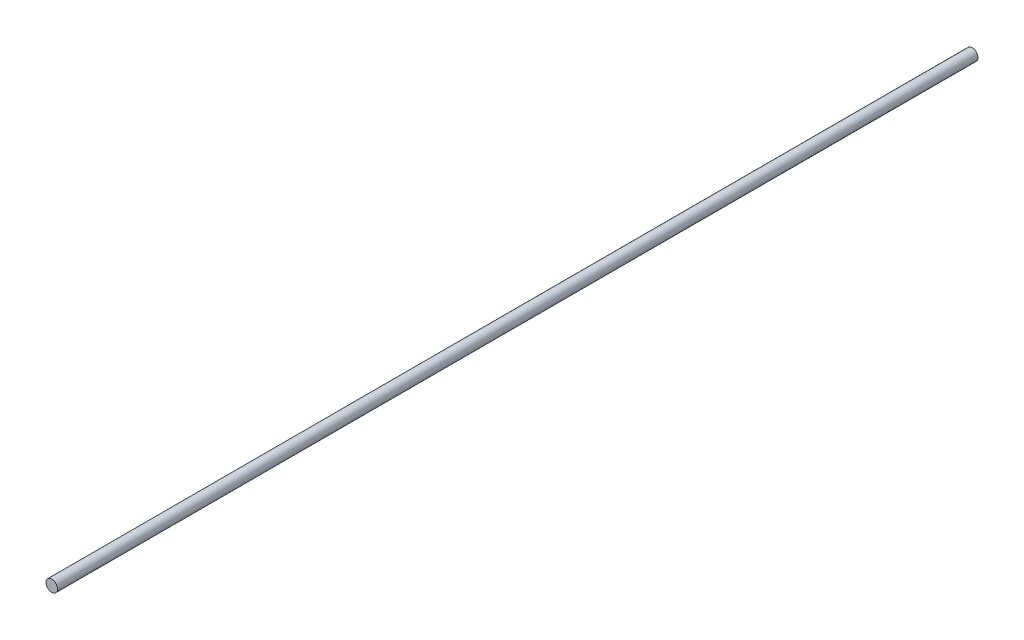
ISO-10303-21;
HEADER;
FILE_DESCRIPTION(('STEP AP214'),'2;1');
FILE_NAME('part.step','',(''),(''),'','','');
FILE_SCHEMA(('AUTOMOTIVE_DESIGN { 1 0 10303 214 1 1 1 1 }'));
ENDSEC;
DATA;
#1=APPLICATION_CONTEXT('core data for automotive mechanical design processes');
#2=APPLICATION_PROTOCOL_DEFINITION('international standard','automotive_design',2000,#1);
#3=PRODUCT_CONTEXT('',#1,'mechanical');
#4=PRODUCT('Part','Part','',(#3));
#5=PRODUCT_RELATED_PRODUCT_CATEGORY('part','',(#4));
#6=PRODUCT_DEFINITION_FORMATION('','',#4);
#7=PRODUCT_DEFINITION_CONTEXT('part definition',#1,'design');
#8=PRODUCT_DEFINITION('design','',#6,#7);
#9=PRODUCT_DEFINITION_SHAPE('','',#8);
#10=(LENGTH_UNIT() NAMED_UNIT(*) SI_UNIT(.MILLI.,.METRE.));
#11=(NAMED_UNIT(*) PLANE_ANGLE_UNIT() SI_UNIT($,.RADIAN.));
#12=(NAMED_UNIT(*) SI_UNIT($,.STERADIAN.) SOLID_ANGLE_UNIT());
#13=UNCERTAINTY_MEASURE_WITH_UNIT(LENGTH_MEASURE(1.E-05),#10,'distance_accuracy_value','');
#14=(GEOMETRIC_REPRESENTATION_CONTEXT(3) GLOBAL_UNCERTAINTY_ASSIGNED_CONTEXT((#13)) GLOBAL_UNIT_ASSIGNED_CONTEXT((#10,
#11,#12)) REPRESENTATION_CONTEXT('',''));
#15=CARTESIAN_POINT('',(0.,0.,0.));
#16=DIRECTION('',(0.,0.,1.));
#17=DIRECTION('',(1.,0.,0.));
#18=AXIS2_PLACEMENT_3D('',#15,#16,#17);
#19=CARTESIAN_POINT('',(0.,0.,800.));
#20=DIRECTION('',(0.,0.,-1.));
#21=DIRECTION('',(-1.,0.,0.));
#22=AXIS2_PLACEMENT_3D('',#19,#20,#21);
#23=CYLINDRICAL_SURFACE('',#22,5.);
#24=CARTESIAN_POINT('',(0.,0.,800.));
#25=DIRECTION('',(0.,0.,1.));
#26=DIRECTION('',(1.,0.,0.));
#27=AXIS2_PLACEMENT_3D('',#24,#25,#26);
#28=CIRCLE('',#27,5.);
#29=CARTESIAN_POINT('',(5.,0.,800.));
#30=VERTEX_POINT('',#29);
#31=EDGE_CURVE('E10',#30,#30,#28,.T.);
#32=ORIENTED_EDGE('',*,*,#31,.F.);
#33=EDGE_LOOP('',(#32));
#34=FACE_BOUND('',#33,.T.);
#35=CARTESIAN_POINT('',(0.,0.,0.));
#36=DIRECTION('',(0.,0.,1.));
#37=DIRECTION('',(1.,0.,0.));
#38=AXIS2_PLACEMENT_3D('',#35,#36,#37);
#39=CIRCLE('',#38,5.);
#40=CARTESIAN_POINT('',(5.,0.,0.));
#41=VERTEX_POINT('',#40);
#42=EDGE_CURVE('E34',#41,#41,#39,.T.);
#43=ORIENTED_EDGE('',*,*,#42,.T.);
#44=EDGE_LOOP('',(#43));
#45=FACE_BOUND('',#44,.T.);
#46=ADVANCED_FACE('F31',(#34,#45),#23,.T.);
#47=CARTESIAN_POINT('',(0.,0.,800.));
#48=DIRECTION('',(0.,0.,1.));
#49=DIRECTION('',(1.,0.,0.));
#50=AXIS2_PLACEMENT_3D('',#47,#48,#49);
#51=PLANE('',#50);
#52=ORIENTED_EDGE('',*,*,#31,.T.);
#53=EDGE_LOOP('',(#52));
#54=FACE_BOUND('',#53,.T.);
#55=ADVANCED_FACE('F46',(#54),#51,.T.);
#56=CARTESIAN_POINT('',(0.,0.,0.));
#57=DIRECTION('',(0.,0.,1.));
#58=DIRECTION('',(1.,0.,0.));
#59=AXIS2_PLACEMENT_3D('',#56,#57,#58);
#60=PLANE('',#59);
#61=ORIENTED_EDGE('',*,*,#42,.F.);
#62=EDGE_LOOP('',(#61));
#63=FACE_BOUND('',#62,.T.);
#64=ADVANCED_FACE('F44',(#63),#60,.F.);
#65=CLOSED_SHELL('',(#46,#55,#64));
#66=MANIFOLD_SOLID_BREP('B2',#65);
#67=ADVANCED_BREP_SHAPE_REPRESENTATION('',(#18,#66),#14);
#68=SHAPE_DEFINITION_REPRESENTATION(#9,#67);
ENDSEC;
END-ISO-10303-21;
